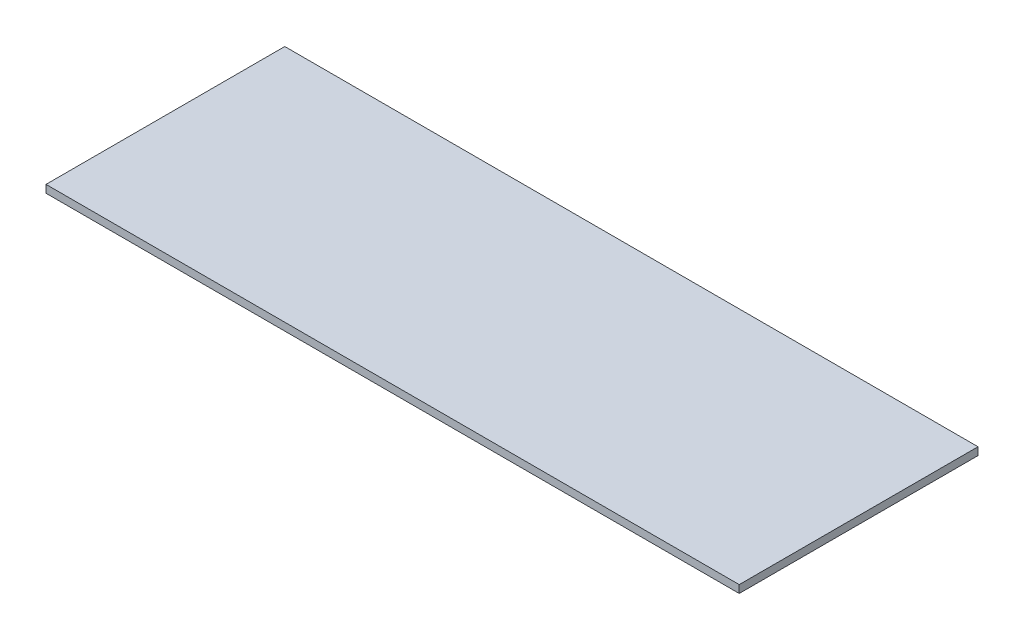
ISO-10303-21;
HEADER;
FILE_DESCRIPTION(('STEP AP214'),'2;1');
FILE_NAME('part.step','',(''),(''),'','','');
FILE_SCHEMA(('AUTOMOTIVE_DESIGN { 1 0 10303 214 1 1 1 1 }'));
ENDSEC;
DATA;
#1=APPLICATION_CONTEXT('core data for automotive mechanical design processes');
#2=APPLICATION_PROTOCOL_DEFINITION('international standard','automotive_design',2000,#1);
#3=PRODUCT_CONTEXT('',#1,'mechanical');
#4=PRODUCT('Part','Part','',(#3));
#5=PRODUCT_RELATED_PRODUCT_CATEGORY('part','',(#4));
#6=PRODUCT_DEFINITION_FORMATION('','',#4);
#7=PRODUCT_DEFINITION_CONTEXT('part definition',#1,'design');
#8=PRODUCT_DEFINITION('design','',#6,#7);
#9=PRODUCT_DEFINITION_SHAPE('','',#8);
#10=(LENGTH_UNIT() NAMED_UNIT(*) SI_UNIT(.MILLI.,.METRE.));
#11=(NAMED_UNIT(*) PLANE_ANGLE_UNIT() SI_UNIT($,.RADIAN.));
#12=(NAMED_UNIT(*) SI_UNIT($,.STERADIAN.) SOLID_ANGLE_UNIT());
#13=UNCERTAINTY_MEASURE_WITH_UNIT(LENGTH_MEASURE(1.E-05),#10,'distance_accuracy_value','');
#14=(GEOMETRIC_REPRESENTATION_CONTEXT(3) GLOBAL_UNCERTAINTY_ASSIGNED_CONTEXT((#13)) GLOBAL_UNIT_ASSIGNED_CONTEXT((#10,
#11,#12)) REPRESENTATION_CONTEXT('',''));
#15=CARTESIAN_POINT('',(0.,0.,0.));
#16=DIRECTION('',(0.,0.,1.));
#17=DIRECTION('',(1.,0.,0.));
#18=AXIS2_PLACEMENT_3D('',#15,#16,#17);
#19=CARTESIAN_POINT('',(-47.205,-4.74987113289998,-0.200000000000013));
#20=DIRECTION('',(0.,-1.,0.));
#21=DIRECTION('',(-1.,0.,0.));
#22=AXIS2_PLACEMENT_3D('',#19,#20,#21);
#23=PLANE('',#22);
#24=DIRECTION('',(1.,0.,0.));
#25=VECTOR('',#24,1.);
#26=CARTESIAN_POINT('',(-69.705,-4.74987113289998,7.55));
#27=LINE('',#26,#25);
#28=CARTESIAN_POINT('',(-69.705,-4.74987113289998,7.55));
#29=VERTEX_POINT('',#28);
#30=CARTESIAN_POINT('',(-24.705,-4.74987113289998,7.55));
#31=VERTEX_POINT('',#30);
#32=EDGE_CURVE('E25',#29,#31,#27,.T.);
#33=ORIENTED_EDGE('',*,*,#32,.T.);
#34=DIRECTION('',(0.,0.,-1.));
#35=VECTOR('',#34,1.);
#36=CARTESIAN_POINT('',(-24.705,-4.74987113289998,7.55));
#37=LINE('',#36,#35);
#38=CARTESIAN_POINT('',(-24.705,-4.74987113289998,-7.95));
#39=VERTEX_POINT('',#38);
#40=EDGE_CURVE('E89',#31,#39,#37,.T.);
#41=ORIENTED_EDGE('',*,*,#40,.T.);
#42=DIRECTION('',(-1.,0.,0.));
#43=VECTOR('',#42,1.);
#44=CARTESIAN_POINT('',(-24.705,-4.74987113289998,-7.95));
#45=LINE('',#44,#43);
#46=CARTESIAN_POINT('',(-69.705,-4.74987113289998,-7.95));
#47=VERTEX_POINT('',#46);
#48=EDGE_CURVE('E74',#39,#47,#45,.T.);
#49=ORIENTED_EDGE('',*,*,#48,.T.);
#50=DIRECTION('',(0.,0.,-1.));
#51=VECTOR('',#50,1.);
#52=CARTESIAN_POINT('',(-69.705,-4.74987113289998,7.55));
#53=LINE('',#52,#51);
#54=EDGE_CURVE('E107',#29,#47,#53,.T.);
#55=ORIENTED_EDGE('',*,*,#54,.F.);
#56=EDGE_LOOP('',(#33,#41,#49,#55));
#57=FACE_BOUND('',#56,.T.);
#58=ADVANCED_FACE('F16',(#57),#23,.F.);
#59=CARTESIAN_POINT('',(-47.205,-5.24987113289999,-0.200000000000014));
#60=DIRECTION('',(0.,-1.,0.));
#61=DIRECTION('',(0.,0.,-1.));
#62=AXIS2_PLACEMENT_3D('',#59,#60,#61);
#63=PLANE('',#62);
#64=DIRECTION('',(-1.,0.,0.));
#65=VECTOR('',#64,1.);
#66=CARTESIAN_POINT('',(-69.705,-5.24987113289999,7.55));
#67=LINE('',#66,#65);
#68=CARTESIAN_POINT('',(-24.705,-5.24987113289999,7.55));
#69=VERTEX_POINT('',#68);
#70=CARTESIAN_POINT('',(-69.705,-5.24987113289999,7.55));
#71=VERTEX_POINT('',#70);
#72=EDGE_CURVE('E11',#69,#71,#67,.T.);
#73=ORIENTED_EDGE('',*,*,#72,.T.);
#74=DIRECTION('',(0.,0.,-1.));
#75=VECTOR('',#74,1.);
#76=CARTESIAN_POINT('',(-69.705,-5.24987113289999,7.55));
#77=LINE('',#76,#75);
#78=CARTESIAN_POINT('',(-69.705,-5.24987113289999,-7.95));
#79=VERTEX_POINT('',#78);
#80=EDGE_CURVE('E104',#71,#79,#77,.T.);
#81=ORIENTED_EDGE('',*,*,#80,.T.);
#82=DIRECTION('',(1.,0.,0.));
#83=VECTOR('',#82,1.);
#84=CARTESIAN_POINT('',(-24.705,-5.24987113289999,-7.95));
#85=LINE('',#84,#83);
#86=CARTESIAN_POINT('',(-24.705,-5.24987113289999,-7.95));
#87=VERTEX_POINT('',#86);
#88=EDGE_CURVE('E64',#79,#87,#85,.T.);
#89=ORIENTED_EDGE('',*,*,#88,.T.);
#90=DIRECTION('',(0.,0.,1.));
#91=VECTOR('',#90,1.);
#92=CARTESIAN_POINT('',(-24.705,-5.24987113289999,7.55));
#93=LINE('',#92,#91);
#94=EDGE_CURVE('E90',#87,#69,#93,.T.);
#95=ORIENTED_EDGE('',*,*,#94,.T.);
#96=EDGE_LOOP('',(#73,#81,#89,#95));
#97=FACE_BOUND('',#96,.T.);
#98=ADVANCED_FACE('F122',(#97),#63,.T.);
#99=CARTESIAN_POINT('',(-24.705,-4.74987113289998,7.55));
#100=DIRECTION('',(0.,0.,1.));
#101=DIRECTION('',(1.,0.,0.));
#102=AXIS2_PLACEMENT_3D('',#99,#100,#101);
#103=PLANE('',#102);
#104=ORIENTED_EDGE('',*,*,#32,.F.);
#105=DIRECTION('',(0.,-1.,0.));
#106=VECTOR('',#105,1.);
#107=CARTESIAN_POINT('',(-69.705,-4.74987113289998,7.55));
#108=LINE('',#107,#106);
#109=EDGE_CURVE('E106',#29,#71,#108,.T.);
#110=ORIENTED_EDGE('',*,*,#109,.T.);
#111=ORIENTED_EDGE('',*,*,#72,.F.);
#112=DIRECTION('',(0.,-1.,0.));
#113=VECTOR('',#112,1.);
#114=CARTESIAN_POINT('',(-24.705,-4.74987113289998,7.55));
#115=LINE('',#114,#113);
#116=EDGE_CURVE('E94',#31,#69,#115,.T.);
#117=ORIENTED_EDGE('',*,*,#116,.F.);
#118=EDGE_LOOP('',(#104,#110,#111,#117));
#119=FACE_BOUND('',#118,.T.);
#120=ADVANCED_FACE('F124',(#119),#103,.T.);
#121=CARTESIAN_POINT('',(-69.705,-4.74987113289998,7.55));
#122=DIRECTION('',(-1.,0.,0.));
#123=DIRECTION('',(0.,1.,0.));
#124=AXIS2_PLACEMENT_3D('',#121,#122,#123);
#125=PLANE('',#124);
#126=ORIENTED_EDGE('',*,*,#54,.T.);
#127=DIRECTION('',(0.,-1.,0.));
#128=VECTOR('',#127,1.);
#129=CARTESIAN_POINT('',(-69.705,-4.74987113289998,-7.95));
#130=LINE('',#129,#128);
#131=EDGE_CURVE('E80',#47,#79,#130,.T.);
#132=ORIENTED_EDGE('',*,*,#131,.T.);
#133=ORIENTED_EDGE('',*,*,#80,.F.);
#134=ORIENTED_EDGE('',*,*,#109,.F.);
#135=EDGE_LOOP('',(#126,#132,#133,#134));
#136=FACE_BOUND('',#135,.T.);
#137=ADVANCED_FACE('F121',(#136),#125,.T.);
#138=CARTESIAN_POINT('',(-69.705,-4.74987113289998,-7.95));
#139=DIRECTION('',(0.,0.,-1.));
#140=DIRECTION('',(0.,-1.,0.));
#141=AXIS2_PLACEMENT_3D('',#138,#139,#140);
#142=PLANE('',#141);
#143=ORIENTED_EDGE('',*,*,#48,.F.);
#144=DIRECTION('',(0.,-1.,0.));
#145=VECTOR('',#144,1.);
#146=CARTESIAN_POINT('',(-24.705,-4.74987113289998,-7.95));
#147=LINE('',#146,#145);
#148=EDGE_CURVE('E77',#39,#87,#147,.T.);
#149=ORIENTED_EDGE('',*,*,#148,.T.);
#150=ORIENTED_EDGE('',*,*,#88,.F.);
#151=ORIENTED_EDGE('',*,*,#131,.F.);
#152=EDGE_LOOP('',(#143,#149,#150,#151));
#153=FACE_BOUND('',#152,.T.);
#154=ADVANCED_FACE('F76',(#153),#142,.T.);
#155=CARTESIAN_POINT('',(-24.705,-4.74987113289998,-7.95));
#156=DIRECTION('',(1.,0.,0.));
#157=DIRECTION('',(0.,0.,-1.));
#158=AXIS2_PLACEMENT_3D('',#155,#156,#157);
#159=PLANE('',#158);
#160=ORIENTED_EDGE('',*,*,#40,.F.);
#161=ORIENTED_EDGE('',*,*,#116,.T.);
#162=ORIENTED_EDGE('',*,*,#94,.F.);
#163=ORIENTED_EDGE('',*,*,#148,.F.);
#164=EDGE_LOOP('',(#160,#161,#162,#163));
#165=FACE_BOUND('',#164,.T.);
#166=ADVANCED_FACE('F18',(#165),#159,.T.);
#167=CLOSED_SHELL('',(#58,#98,#120,#137,#154,#166));
#168=MANIFOLD_SOLID_BREP('B1',#167);
#169=ADVANCED_BREP_SHAPE_REPRESENTATION('',(#18,#168),#14);
#170=SHAPE_DEFINITION_REPRESENTATION(#9,#169);
ENDSEC;
END-ISO-10303-21;
